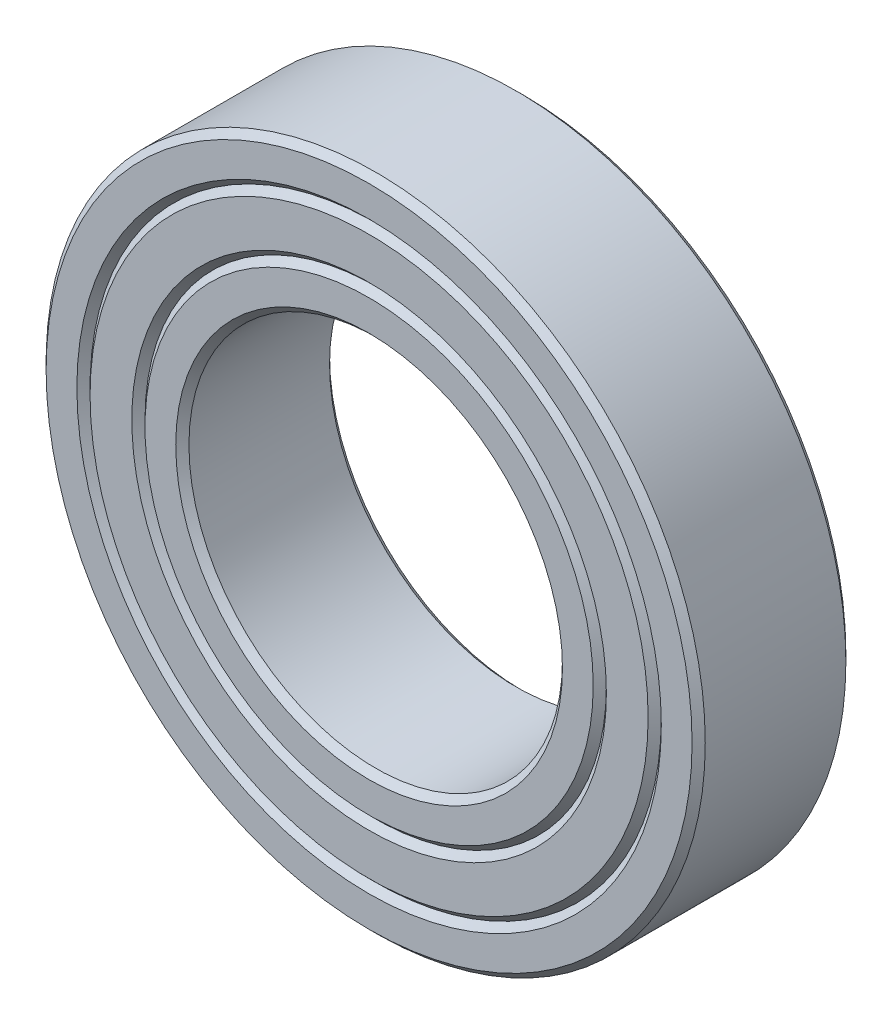
ISO-10303-21;
HEADER;
FILE_DESCRIPTION(('STEP AP214'),'2;1');
FILE_NAME('part.step','',(''),(''),'','','');
FILE_SCHEMA(('AUTOMOTIVE_DESIGN { 1 0 10303 214 1 1 1 1 }'));
ENDSEC;
DATA;
#1=APPLICATION_CONTEXT('core data for automotive mechanical design processes');
#2=APPLICATION_PROTOCOL_DEFINITION('international standard','automotive_design',2000,#1);
#3=PRODUCT_CONTEXT('',#1,'mechanical');
#4=PRODUCT('Part','Part','',(#3));
#5=PRODUCT_RELATED_PRODUCT_CATEGORY('part','',(#4));
#6=PRODUCT_DEFINITION_FORMATION('','',#4);
#7=PRODUCT_DEFINITION_CONTEXT('part definition',#1,'design');
#8=PRODUCT_DEFINITION('design','',#6,#7);
#9=PRODUCT_DEFINITION_SHAPE('','',#8);
#10=(LENGTH_UNIT() NAMED_UNIT(*) SI_UNIT(.MILLI.,.METRE.));
#11=(NAMED_UNIT(*) PLANE_ANGLE_UNIT() SI_UNIT($,.RADIAN.));
#12=(NAMED_UNIT(*) SI_UNIT($,.STERADIAN.) SOLID_ANGLE_UNIT());
#13=UNCERTAINTY_MEASURE_WITH_UNIT(LENGTH_MEASURE(1.E-05),#10,'distance_accuracy_value','');
#14=(GEOMETRIC_REPRESENTATION_CONTEXT(3) GLOBAL_UNCERTAINTY_ASSIGNED_CONTEXT((#13)) GLOBAL_UNIT_ASSIGNED_CONTEXT((#10,
#11,#12)) REPRESENTATION_CONTEXT('',''));
#15=CARTESIAN_POINT('',(0.,0.,0.));
#16=DIRECTION('',(0.,0.,1.));
#17=DIRECTION('',(1.,0.,0.));
#18=AXIS2_PLACEMENT_3D('',#15,#16,#17);
#19=CARTESIAN_POINT('',(0.,0.,-3.51));
#20=DIRECTION('',(0.,0.,1.));
#21=DIRECTION('',(1.,0.,0.));
#22=AXIS2_PLACEMENT_3D('',#19,#20,#21);
#23=CYLINDRICAL_SURFACE('',#22,10.5);
#24=CARTESIAN_POINT('',(0.,0.,-3.19999999999999));
#25=DIRECTION('',(0.,0.,1.));
#26=DIRECTION('',(1.,0.,0.));
#27=AXIS2_PLACEMENT_3D('',#24,#25,#26);
#28=CIRCLE('',#27,10.5);
#29=CARTESIAN_POINT('',(10.5,0.,-3.19999999999999));
#30=VERTEX_POINT('',#29);
#31=EDGE_CURVE('E75',#30,#30,#28,.T.);
#32=CARTESIAN_POINT('',(0.,0.,3.2));
#33=DIRECTION('',(0.,0.,1.));
#34=DIRECTION('',(1.,0.,0.));
#35=AXIS2_PLACEMENT_3D('',#32,#33,#34);
#36=CIRCLE('',#35,10.5);
#37=CARTESIAN_POINT('',(10.5,0.,3.2));
#38=VERTEX_POINT('',#37);
#39=EDGE_CURVE('E78',#38,#38,#36,.F.);
#40=CARTESIAN_POINT('',(10.5,0.,-3.19999999999999));
#41=CARTESIAN_POINT('',(10.5,0.,-3.13333333333332));
#42=CARTESIAN_POINT('',(10.5,0.,-3.06666666666665));
#43=CARTESIAN_POINT('',(10.5,0.,-2.93333333333332));
#44=CARTESIAN_POINT('',(10.5,0.,-2.86666666666666));
#45=CARTESIAN_POINT('',(10.5,0.,-2.73333333333332));
#46=CARTESIAN_POINT('',(10.5,0.,-2.66666666666666));
#47=CARTESIAN_POINT('',(10.5,0.,-2.53333333333332));
#48=CARTESIAN_POINT('',(10.5,0.,-2.46666666666666));
#49=CARTESIAN_POINT('',(10.5,0.,-2.33333333333332));
#50=CARTESIAN_POINT('',(10.5,0.,-2.26666666666666));
#51=CARTESIAN_POINT('',(10.5,0.,-2.13333333333332));
#52=CARTESIAN_POINT('',(10.5,0.,-2.06666666666666));
#53=CARTESIAN_POINT('',(10.5,0.,-1.93333333333332));
#54=CARTESIAN_POINT('',(10.5,0.,-1.86666666666666));
#55=CARTESIAN_POINT('',(10.5,0.,-1.73333333333332));
#56=CARTESIAN_POINT('',(10.5,0.,-1.66666666666666));
#57=CARTESIAN_POINT('',(10.5,0.,-1.53333333333332));
#58=CARTESIAN_POINT('',(10.5,0.,-1.46666666666666));
#59=CARTESIAN_POINT('',(10.5,0.,-1.33333333333332));
#60=CARTESIAN_POINT('',(10.5,0.,-1.26666666666666));
#61=CARTESIAN_POINT('',(10.5,0.,-1.13333333333332));
#62=CARTESIAN_POINT('',(10.5,0.,-1.06666666666666));
#63=CARTESIAN_POINT('',(10.5,0.,-0.933333333333325));
#64=CARTESIAN_POINT('',(10.5,0.,-0.866666666666658));
#65=CARTESIAN_POINT('',(10.5,0.,-0.733333333333325));
#66=CARTESIAN_POINT('',(10.5,0.,-0.666666666666659));
#67=CARTESIAN_POINT('',(10.5,0.,-0.533333333333326));
#68=CARTESIAN_POINT('',(10.5,0.,-0.466666666666659));
#69=CARTESIAN_POINT('',(10.5,0.,-0.333333333333326));
#70=CARTESIAN_POINT('',(10.5,0.,-0.266666666666659));
#71=CARTESIAN_POINT('',(10.5,0.,-0.133333333333326));
#72=CARTESIAN_POINT('',(10.5,0.,-0.0666666666666596));
#73=CARTESIAN_POINT('',(10.5,0.,0.0666666666666735));
#74=CARTESIAN_POINT('',(10.5,0.,0.13333333333334));
#75=CARTESIAN_POINT('',(10.5,0.,0.266666666666673));
#76=CARTESIAN_POINT('',(10.5,0.,0.333333333333339));
#77=CARTESIAN_POINT('',(10.5,0.,0.466666666666672));
#78=CARTESIAN_POINT('',(10.5,0.,0.533333333333339));
#79=CARTESIAN_POINT('',(10.5,0.,0.666666666666672));
#80=CARTESIAN_POINT('',(10.5,0.,0.733333333333338));
#81=CARTESIAN_POINT('',(10.5,0.,0.866666666666671));
#82=CARTESIAN_POINT('',(10.5,0.,0.933333333333338));
#83=CARTESIAN_POINT('',(10.5,0.,1.06666666666667));
#84=CARTESIAN_POINT('',(10.5,0.,1.13333333333334));
#85=CARTESIAN_POINT('',(10.5,0.,1.26666666666667));
#86=CARTESIAN_POINT('',(10.5,0.,1.33333333333334));
#87=CARTESIAN_POINT('',(10.5,0.,1.46666666666667));
#88=CARTESIAN_POINT('',(10.5,0.,1.53333333333334));
#89=CARTESIAN_POINT('',(10.5,0.,1.66666666666667));
#90=CARTESIAN_POINT('',(10.5,0.,1.73333333333334));
#91=CARTESIAN_POINT('',(10.5,0.,1.86666666666667));
#92=CARTESIAN_POINT('',(10.5,0.,1.93333333333334));
#93=CARTESIAN_POINT('',(10.5,0.,2.06666666666667));
#94=CARTESIAN_POINT('',(10.5,0.,2.13333333333334));
#95=CARTESIAN_POINT('',(10.5,0.,2.26666666666667));
#96=CARTESIAN_POINT('',(10.5,0.,2.33333333333334));
#97=CARTESIAN_POINT('',(10.5,0.,2.46666666666667));
#98=CARTESIAN_POINT('',(10.5,0.,2.53333333333334));
#99=CARTESIAN_POINT('',(10.5,0.,2.66666666666667));
#100=CARTESIAN_POINT('',(10.5,0.,2.73333333333334));
#101=CARTESIAN_POINT('',(10.5,0.,2.86666666666667));
#102=CARTESIAN_POINT('',(10.5,0.,2.93333333333333));
#103=CARTESIAN_POINT('',(10.5,0.,3.06666666666667));
#104=CARTESIAN_POINT('',(10.5,0.,3.13333333333333));
#105=CARTESIAN_POINT('',(10.5,0.,3.2));
#106=B_SPLINE_CURVE_WITH_KNOTS('',3,(#40,#41,#42,#43,#44,#45,#46,#47,#48,#49,#50,#51,#52,#53,
#54,#55,#56,#57,#58,#59,#60,#61,#62,#63,#64,#65,#66,#67,#68,#69,#70,#71,#72,#73,#74,#75,#76,#77,
#78,#79,#80,#81,#82,#83,#84,#85,#86,#87,#88,#89,#90,#91,#92,#93,#94,#95,#96,#97,#98,#99,#100,
#101,#102,#103,#104,#105),.UNSPECIFIED.,.F.,.F.,(4,2,2,2,2,2,2,2,2,2,2,2,2,2,2,2,2,2,2,2,2,2,2,
2,2,2,2,2,2,2,2,2,4),(0.,0.2,0.399999999999999,0.599999999999999,0.799999999999998,
0.999999999999998,1.2,1.4,1.6,1.8,2.,2.2,2.4,2.6,2.8,3.,3.19999999999999,3.39999999999999,
3.59999999999999,3.79999999999999,3.99999999999999,4.19999999999999,4.39999999999999,
4.59999999999999,4.79999999999999,4.99999999999999,5.19999999999999,5.39999999999999,
5.59999999999999,5.79999999999999,5.99999999999999,6.19999999999999,6.39999999999999),.UNSPECIFIED.);
#107=EDGE_CURVE('BSEAM48',#30,#38,#106,.T.);
#108=ORIENTED_EDGE('',*,*,#31,.T.);
#109=ORIENTED_EDGE('',*,*,#39,.T.);
#110=ORIENTED_EDGE('',*,*,#107,.T.);
#111=ORIENTED_EDGE('',*,*,#107,.F.);
#112=EDGE_LOOP('',(#108,#110,#109,#111));
#113=FACE_BOUND('',#112,.T.);
#114=ADVANCED_FACE('F48',(#113),#23,.T.);
#115=CARTESIAN_POINT('',(0.,0.,3.5));
#116=DIRECTION('',(0.,0.,-1.));
#117=DIRECTION('',(-1.,0.,0.));
#118=AXIS2_PLACEMENT_3D('',#115,#116,#117);
#119=CYLINDRICAL_SURFACE('',#118,8.5);
#120=CARTESIAN_POINT('',(0.,0.,-3.2));
#121=DIRECTION('',(0.,0.,1.));
#122=DIRECTION('',(1.,0.,0.));
#123=AXIS2_PLACEMENT_3D('',#120,#121,#122);
#124=CIRCLE('',#123,8.5);
#125=CARTESIAN_POINT('',(8.5,0.,-3.2));
#126=VERTEX_POINT('',#125);
#127=EDGE_CURVE('E60',#126,#126,#124,.F.);
#128=ORIENTED_EDGE('',*,*,#127,.T.);
#129=EDGE_LOOP('',(#128));
#130=FACE_BOUND('',#129,.T.);
#131=CARTESIAN_POINT('',(0.,0.,3.2));
#132=DIRECTION('',(0.,0.,1.));
#133=DIRECTION('',(1.,0.,0.));
#134=AXIS2_PLACEMENT_3D('',#131,#132,#133);
#135=CIRCLE('',#134,8.5);
#136=CARTESIAN_POINT('',(8.5,0.,3.2));
#137=VERTEX_POINT('',#136);
#138=EDGE_CURVE('E64',#137,#137,#135,.T.);
#139=ORIENTED_EDGE('',*,*,#138,.T.);
#140=EDGE_LOOP('',(#139));
#141=FACE_BOUND('',#140,.T.);
#142=ADVANCED_FACE('F96',(#130,#141),#119,.F.);
#143=CARTESIAN_POINT('',(0.,0.,-3.5));
#144=DIRECTION('',(0.,0.,1.));
#145=DIRECTION('',(1.,0.,0.));
#146=AXIS2_PLACEMENT_3D('',#143,#144,#145);
#147=PLANE('',#146);
#148=CARTESIAN_POINT('',(0.,0.,-3.5));
#149=DIRECTION('',(0.,0.,1.));
#150=DIRECTION('',(1.,0.,0.));
#151=AXIS2_PLACEMENT_3D('',#148,#149,#150);
#152=CIRCLE('',#151,10.2);
#153=CARTESIAN_POINT('',(10.2,0.,-3.5));
#154=VERTEX_POINT('',#153);
#155=EDGE_CURVE('E69',#154,#154,#152,.F.);
#156=ORIENTED_EDGE('',*,*,#155,.T.);
#157=EDGE_LOOP('',(#156));
#158=FACE_BOUND('',#157,.T.);
#159=CARTESIAN_POINT('',(0.,0.,-3.5));
#160=DIRECTION('',(0.,0.,1.));
#161=DIRECTION('',(1.,0.,0.));
#162=AXIS2_PLACEMENT_3D('',#159,#160,#161);
#163=CIRCLE('',#162,8.8);
#164=CARTESIAN_POINT('',(8.8,0.,-3.5));
#165=VERTEX_POINT('',#164);
#166=EDGE_CURVE('E72',#165,#165,#163,.T.);
#167=ORIENTED_EDGE('',*,*,#166,.T.);
#168=EDGE_LOOP('',(#167));
#169=FACE_BOUND('',#168,.T.);
#170=ADVANCED_FACE('F98',(#158,#169),#147,.F.);
#171=CARTESIAN_POINT('',(0.,0.,3.5));
#172=DIRECTION('',(0.,0.,1.));
#173=DIRECTION('',(1.,0.,0.));
#174=AXIS2_PLACEMENT_3D('',#171,#172,#173);
#175=PLANE('',#174);
#176=CARTESIAN_POINT('',(0.,0.,3.5));
#177=DIRECTION('',(0.,0.,1.));
#178=DIRECTION('',(1.,0.,0.));
#179=AXIS2_PLACEMENT_3D('',#176,#177,#178);
#180=CIRCLE('',#179,10.2);
#181=CARTESIAN_POINT('',(10.2,0.,3.5));
#182=VERTEX_POINT('',#181);
#183=EDGE_CURVE('E11',#182,#182,#180,.T.);
#184=ORIENTED_EDGE('',*,*,#183,.T.);
#185=EDGE_LOOP('',(#184));
#186=FACE_BOUND('',#185,.T.);
#187=CARTESIAN_POINT('',(0.,0.,3.5));
#188=DIRECTION('',(0.,0.,1.));
#189=DIRECTION('',(1.,0.,0.));
#190=AXIS2_PLACEMENT_3D('',#187,#188,#189);
#191=CIRCLE('',#190,8.8);
#192=CARTESIAN_POINT('',(8.8,0.,3.5));
#193=VERTEX_POINT('',#192);
#194=EDGE_CURVE('E56',#193,#193,#191,.F.);
#195=ORIENTED_EDGE('',*,*,#194,.T.);
#196=EDGE_LOOP('',(#195));
#197=FACE_BOUND('',#196,.T.);
#198=ADVANCED_FACE('F105',(#186,#197),#175,.T.);
#199=CARTESIAN_POINT('',(0.,0.,-3.19999999999999));
#200=DIRECTION('',(0.,0.,1.));
#201=DIRECTION('',(1.,0.,0.));
#202=AXIS2_PLACEMENT_3D('',#199,#200,#201);
#203=CONICAL_SURFACE('',#202,10.5,0.785398163397448);
#204=ORIENTED_EDGE('',*,*,#155,.F.);
#205=EDGE_LOOP('',(#204));
#206=FACE_BOUND('',#205,.T.);
#207=ORIENTED_EDGE('',*,*,#31,.F.);
#208=EDGE_LOOP('',(#207));
#209=FACE_BOUND('',#208,.T.);
#210=ADVANCED_FACE('F92',(#206,#209),#203,.T.);
#211=CARTESIAN_POINT('',(0.,0.,-3.5));
#212=DIRECTION('',(0.,0.,-1.));
#213=DIRECTION('',(-1.,0.,0.));
#214=AXIS2_PLACEMENT_3D('',#211,#212,#213);
#215=CONICAL_SURFACE('',#214,8.8,0.78539816339744);
#216=ORIENTED_EDGE('',*,*,#127,.F.);
#217=EDGE_LOOP('',(#216));
#218=FACE_BOUND('',#217,.T.);
#219=ORIENTED_EDGE('',*,*,#166,.F.);
#220=EDGE_LOOP('',(#219));
#221=FACE_BOUND('',#220,.T.);
#222=ADVANCED_FACE('F86',(#218,#221),#215,.F.);
#223=CARTESIAN_POINT('',(0.,0.,3.5));
#224=DIRECTION('',(0.,0.,-1.));
#225=DIRECTION('',(-1.,0.,0.));
#226=AXIS2_PLACEMENT_3D('',#223,#224,#225);
#227=CONICAL_SURFACE('',#226,10.2,0.785398163397437);
#228=ORIENTED_EDGE('',*,*,#39,.F.);
#229=EDGE_LOOP('',(#228));
#230=FACE_BOUND('',#229,.T.);
#231=ORIENTED_EDGE('',*,*,#183,.F.);
#232=EDGE_LOOP('',(#231));
#233=FACE_BOUND('',#232,.T.);
#234=ADVANCED_FACE('F83',(#230,#233),#227,.T.);
#235=CARTESIAN_POINT('',(0.,0.,3.2));
#236=DIRECTION('',(0.,0.,1.));
#237=DIRECTION('',(1.,0.,0.));
#238=AXIS2_PLACEMENT_3D('',#235,#236,#237);
#239=CONICAL_SURFACE('',#238,8.5,0.785398163397445);
#240=ORIENTED_EDGE('',*,*,#194,.F.);
#241=EDGE_LOOP('',(#240));
#242=FACE_BOUND('',#241,.T.);
#243=ORIENTED_EDGE('',*,*,#138,.F.);
#244=EDGE_LOOP('',(#243));
#245=FACE_BOUND('',#244,.T.);
#246=ADVANCED_FACE('F51',(#242,#245),#239,.F.);
#247=CLOSED_SHELL('',(#114,#142,#170,#198,#210,#222,#234,#246));
#248=MANIFOLD_SOLID_BREP('B2',#247);
#249=CARTESIAN_POINT('',(0.,0.,-3.51));
#250=DIRECTION('',(0.,0.,1.));
#251=DIRECTION('',(1.,0.,0.));
#252=AXIS2_PLACEMENT_3D('',#249,#250,#251);
#253=CYLINDRICAL_SURFACE('',#252,10.5);
#254=CARTESIAN_POINT('',(0.,0.,3.19999999999998));
#255=DIRECTION('',(0.,0.,1.));
#256=DIRECTION('',(1.,0.,0.));
#257=AXIS2_PLACEMENT_3D('',#254,#255,#256);
#258=CIRCLE('',#257,10.5);
#259=CARTESIAN_POINT('',(10.5,0.,3.19999999999998));
#260=VERTEX_POINT('',#259);
#261=EDGE_CURVE('E201',#260,#260,#258,.T.);
#262=CARTESIAN_POINT('',(0.,0.,-3.20000000000001));
#263=DIRECTION('',(0.,0.,1.));
#264=DIRECTION('',(1.,0.,0.));
#265=AXIS2_PLACEMENT_3D('',#262,#263,#264);
#266=CIRCLE('',#265,10.5);
#267=CARTESIAN_POINT('',(10.5,0.,-3.20000000000001));
#268=VERTEX_POINT('',#267);
#269=EDGE_CURVE('E205',#268,#268,#266,.F.);
#270=CARTESIAN_POINT('',(10.5,0.,3.19999999999998));
#271=CARTESIAN_POINT('',(10.5,0.,3.13333333333331));
#272=CARTESIAN_POINT('',(10.5,0.,3.06666666666664));
#273=CARTESIAN_POINT('',(10.5,0.,2.93333333333331));
#274=CARTESIAN_POINT('',(10.5,0.,2.86666666666664));
#275=CARTESIAN_POINT('',(10.5,0.,2.73333333333331));
#276=CARTESIAN_POINT('',(10.5,0.,2.66666666666664));
#277=CARTESIAN_POINT('',(10.5,0.,2.53333333333331));
#278=CARTESIAN_POINT('',(10.5,0.,2.46666666666665));
#279=CARTESIAN_POINT('',(10.5,0.,2.33333333333331));
#280=CARTESIAN_POINT('',(10.5,0.,2.26666666666665));
#281=CARTESIAN_POINT('',(10.5,0.,2.13333333333331));
#282=CARTESIAN_POINT('',(10.5,0.,2.06666666666665));
#283=CARTESIAN_POINT('',(10.5,0.,1.93333333333331));
#284=CARTESIAN_POINT('',(10.5,0.,1.86666666666665));
#285=CARTESIAN_POINT('',(10.5,0.,1.73333333333331));
#286=CARTESIAN_POINT('',(10.5,0.,1.66666666666665));
#287=CARTESIAN_POINT('',(10.5,0.,1.53333333333331));
#288=CARTESIAN_POINT('',(10.5,0.,1.46666666666665));
#289=CARTESIAN_POINT('',(10.5,0.,1.33333333333331));
#290=CARTESIAN_POINT('',(10.5,0.,1.26666666666665));
#291=CARTESIAN_POINT('',(10.5,0.,1.13333333333331));
#292=CARTESIAN_POINT('',(10.5,0.,1.06666666666665));
#293=CARTESIAN_POINT('',(10.5,0.,0.933333333333313));
#294=CARTESIAN_POINT('',(10.5,0.,0.866666666666647));
#295=CARTESIAN_POINT('',(10.5,0.,0.733333333333314));
#296=CARTESIAN_POINT('',(10.5,0.,0.666666666666647));
#297=CARTESIAN_POINT('',(10.5,0.,0.533333333333314));
#298=CARTESIAN_POINT('',(10.5,0.,0.466666666666648));
#299=CARTESIAN_POINT('',(10.5,0.,0.333333333333315));
#300=CARTESIAN_POINT('',(10.5,0.,0.266666666666648));
#301=CARTESIAN_POINT('',(10.5,0.,0.133333333333315));
#302=CARTESIAN_POINT('',(10.5,0.,0.0666666666666487));
#303=CARTESIAN_POINT('',(10.5,0.,-0.0666666666666843));
#304=CARTESIAN_POINT('',(10.5,0.,-0.133333333333351));
#305=CARTESIAN_POINT('',(10.5,0.,-0.266666666666684));
#306=CARTESIAN_POINT('',(10.5,0.,-0.333333333333351));
#307=CARTESIAN_POINT('',(10.5,0.,-0.466666666666684));
#308=CARTESIAN_POINT('',(10.5,0.,-0.53333333333335));
#309=CARTESIAN_POINT('',(10.5,0.,-0.666666666666683));
#310=CARTESIAN_POINT('',(10.5,0.,-0.73333333333335));
#311=CARTESIAN_POINT('',(10.5,0.,-0.866666666666683));
#312=CARTESIAN_POINT('',(10.5,0.,-0.93333333333335));
#313=CARTESIAN_POINT('',(10.5,0.,-1.06666666666668));
#314=CARTESIAN_POINT('',(10.5,0.,-1.13333333333335));
#315=CARTESIAN_POINT('',(10.5,0.,-1.26666666666668));
#316=CARTESIAN_POINT('',(10.5,0.,-1.33333333333335));
#317=CARTESIAN_POINT('',(10.5,0.,-1.46666666666668));
#318=CARTESIAN_POINT('',(10.5,0.,-1.53333333333335));
#319=CARTESIAN_POINT('',(10.5,0.,-1.66666666666668));
#320=CARTESIAN_POINT('',(10.5,0.,-1.73333333333335));
#321=CARTESIAN_POINT('',(10.5,0.,-1.86666666666668));
#322=CARTESIAN_POINT('',(10.5,0.,-1.93333333333335));
#323=CARTESIAN_POINT('',(10.5,0.,-2.06666666666668));
#324=CARTESIAN_POINT('',(10.5,0.,-2.13333333333335));
#325=CARTESIAN_POINT('',(10.5,0.,-2.26666666666668));
#326=CARTESIAN_POINT('',(10.5,0.,-2.33333333333335));
#327=CARTESIAN_POINT('',(10.5,0.,-2.46666666666668));
#328=CARTESIAN_POINT('',(10.5,0.,-2.53333333333335));
#329=CARTESIAN_POINT('',(10.5,0.,-2.66666666666668));
#330=CARTESIAN_POINT('',(10.5,0.,-2.73333333333335));
#331=CARTESIAN_POINT('',(10.5,0.,-2.86666666666668));
#332=CARTESIAN_POINT('',(10.5,0.,-2.93333333333335));
#333=CARTESIAN_POINT('',(10.5,0.,-3.06666666666668));
#334=CARTESIAN_POINT('',(10.5,0.,-3.13333333333335));
#335=CARTESIAN_POINT('',(10.5,0.,-3.20000000000001));
#336=B_SPLINE_CURVE_WITH_KNOTS('',3,(#270,#271,#272,#273,#274,#275,#276,#277,#278,#279,#280,
#281,#282,#283,#284,#285,#286,#287,#288,#289,#290,#291,#292,#293,#294,#295,#296,#297,#298,#299,
#300,#301,#302,#303,#304,#305,#306,#307,#308,#309,#310,#311,#312,#313,#314,#315,#316,#317,#318,
#319,#320,#321,#322,#323,#324,#325,#326,#327,#328,#329,#330,#331,#332,#333,#334,#335),
.UNSPECIFIED.,.F.,.F.,(4,2,2,2,2,2,2,2,2,2,2,2,2,2,2,2,2,2,2,2,2,2,2,2,2,2,2,2,2,2,2,2,4),(0.,
0.2,0.399999999999999,0.599999999999999,0.799999999999999,0.999999999999998,1.2,1.4,1.6,1.8,2.,
2.2,2.4,2.6,2.8,3.,3.19999999999999,3.39999999999999,3.59999999999999,3.79999999999999,
3.99999999999999,4.19999999999999,4.39999999999999,4.59999999999999,4.79999999999999,
4.99999999999999,5.19999999999999,5.39999999999999,5.59999999999999,5.79999999999999,
5.99999999999999,6.19999999999999,6.39999999999999),.UNSPECIFIED.);
#337=EDGE_CURVE('BSEAM189',#260,#268,#336,.T.);
#338=ORIENTED_EDGE('',*,*,#261,.T.);
#339=ORIENTED_EDGE('',*,*,#269,.T.);
#340=ORIENTED_EDGE('',*,*,#337,.T.);
#341=ORIENTED_EDGE('',*,*,#337,.F.);
#342=EDGE_LOOP('',(#338,#340,#339,#341));
#343=FACE_BOUND('',#342,.T.);
#344=ADVANCED_FACE('F189',(#343),#253,.F.);
#345=CARTESIAN_POINT('',(0.,0.,-3.51));
#346=DIRECTION('',(0.,0.,1.));
#347=DIRECTION('',(1.,0.,0.));
#348=AXIS2_PLACEMENT_3D('',#345,#346,#347);
#349=CYLINDRICAL_SURFACE('',#348,13.);
#350=CARTESIAN_POINT('',(0.,0.,3.20000000000002));
#351=DIRECTION('',(0.,0.,1.));
#352=DIRECTION('',(1.,0.,0.));
#353=AXIS2_PLACEMENT_3D('',#350,#351,#352);
#354=CIRCLE('',#353,13.);
#355=CARTESIAN_POINT('',(13.,0.,3.20000000000002));
#356=VERTEX_POINT('',#355);
#357=EDGE_CURVE('E210',#356,#356,#354,.F.);
#358=CARTESIAN_POINT('',(0.,0.,-3.19999999999999));
#359=DIRECTION('',(0.,0.,1.));
#360=DIRECTION('',(1.,0.,0.));
#361=AXIS2_PLACEMENT_3D('',#358,#359,#360);
#362=CIRCLE('',#361,13.);
#363=CARTESIAN_POINT('',(13.,0.,-3.19999999999999));
#364=VERTEX_POINT('',#363);
#365=EDGE_CURVE('E213',#364,#364,#362,.T.);
#366=CARTESIAN_POINT('',(13.,0.,3.20000000000002));
#367=CARTESIAN_POINT('',(13.,0.,3.13333333333335));
#368=CARTESIAN_POINT('',(13.,0.,3.06666666666668));
#369=CARTESIAN_POINT('',(13.,0.,2.93333333333335));
#370=CARTESIAN_POINT('',(13.,0.,2.86666666666668));
#371=CARTESIAN_POINT('',(13.,0.,2.73333333333335));
#372=CARTESIAN_POINT('',(13.,0.,2.66666666666668));
#373=CARTESIAN_POINT('',(13.,0.,2.53333333333335));
#374=CARTESIAN_POINT('',(13.,0.,2.46666666666668));
#375=CARTESIAN_POINT('',(13.,0.,2.33333333333335));
#376=CARTESIAN_POINT('',(13.,0.,2.26666666666668));
#377=CARTESIAN_POINT('',(13.,0.,2.13333333333335));
#378=CARTESIAN_POINT('',(13.,0.,2.06666666666668));
#379=CARTESIAN_POINT('',(13.,0.,1.93333333333335));
#380=CARTESIAN_POINT('',(13.,0.,1.86666666666668));
#381=CARTESIAN_POINT('',(13.,0.,1.73333333333335));
#382=CARTESIAN_POINT('',(13.,0.,1.66666666666668));
#383=CARTESIAN_POINT('',(13.,0.,1.53333333333335));
#384=CARTESIAN_POINT('',(13.,0.,1.46666666666668));
#385=CARTESIAN_POINT('',(13.,0.,1.33333333333335));
#386=CARTESIAN_POINT('',(13.,0.,1.26666666666668));
#387=CARTESIAN_POINT('',(13.,0.,1.13333333333335));
#388=CARTESIAN_POINT('',(13.,0.,1.06666666666668));
#389=CARTESIAN_POINT('',(13.,0.,0.933333333333346));
#390=CARTESIAN_POINT('',(13.,0.,0.866666666666679));
#391=CARTESIAN_POINT('',(13.,0.,0.733333333333346));
#392=CARTESIAN_POINT('',(13.,0.,0.666666666666679));
#393=CARTESIAN_POINT('',(13.,0.,0.533333333333346));
#394=CARTESIAN_POINT('',(13.,0.,0.466666666666679));
#395=CARTESIAN_POINT('',(13.,0.,0.333333333333346));
#396=CARTESIAN_POINT('',(13.,0.,0.266666666666679));
#397=CARTESIAN_POINT('',(13.,0.,0.133333333333346));
#398=CARTESIAN_POINT('',(13.,0.,0.0666666666666793));
#399=CARTESIAN_POINT('',(13.,0.,-0.0666666666666541));
#400=CARTESIAN_POINT('',(13.,0.,-0.133333333333321));
#401=CARTESIAN_POINT('',(13.,0.,-0.266666666666654));
#402=CARTESIAN_POINT('',(13.,0.,-0.333333333333321));
#403=CARTESIAN_POINT('',(13.,0.,-0.466666666666654));
#404=CARTESIAN_POINT('',(13.,0.,-0.533333333333321));
#405=CARTESIAN_POINT('',(13.,0.,-0.666666666666655));
#406=CARTESIAN_POINT('',(13.,0.,-0.733333333333321));
#407=CARTESIAN_POINT('',(13.,0.,-0.866666666666655));
#408=CARTESIAN_POINT('',(13.,0.,-0.933333333333321));
#409=CARTESIAN_POINT('',(13.,0.,-1.06666666666666));
#410=CARTESIAN_POINT('',(13.,0.,-1.13333333333332));
#411=CARTESIAN_POINT('',(13.,0.,-1.26666666666666));
#412=CARTESIAN_POINT('',(13.,0.,-1.33333333333332));
#413=CARTESIAN_POINT('',(13.,0.,-1.46666666666666));
#414=CARTESIAN_POINT('',(13.,0.,-1.53333333333332));
#415=CARTESIAN_POINT('',(13.,0.,-1.66666666666666));
#416=CARTESIAN_POINT('',(13.,0.,-1.73333333333332));
#417=CARTESIAN_POINT('',(13.,0.,-1.86666666666666));
#418=CARTESIAN_POINT('',(13.,0.,-1.93333333333332));
#419=CARTESIAN_POINT('',(13.,0.,-2.06666666666666));
#420=CARTESIAN_POINT('',(13.,0.,-2.13333333333332));
#421=CARTESIAN_POINT('',(13.,0.,-2.26666666666666));
#422=CARTESIAN_POINT('',(13.,0.,-2.33333333333332));
#423=CARTESIAN_POINT('',(13.,0.,-2.46666666666666));
#424=CARTESIAN_POINT('',(13.,0.,-2.53333333333332));
#425=CARTESIAN_POINT('',(13.,0.,-2.66666666666666));
#426=CARTESIAN_POINT('',(13.,0.,-2.73333333333332));
#427=CARTESIAN_POINT('',(13.,0.,-2.86666666666666));
#428=CARTESIAN_POINT('',(13.,0.,-2.93333333333332));
#429=CARTESIAN_POINT('',(13.,0.,-3.06666666666666));
#430=CARTESIAN_POINT('',(13.,0.,-3.13333333333332));
#431=CARTESIAN_POINT('',(13.,0.,-3.19999999999999));
#432=B_SPLINE_CURVE_WITH_KNOTS('',3,(#366,#367,#368,#369,#370,#371,#372,#373,#374,#375,#376,
#377,#378,#379,#380,#381,#382,#383,#384,#385,#386,#387,#388,#389,#390,#391,#392,#393,#394,#395,
#396,#397,#398,#399,#400,#401,#402,#403,#404,#405,#406,#407,#408,#409,#410,#411,#412,#413,#414,
#415,#416,#417,#418,#419,#420,#421,#422,#423,#424,#425,#426,#427,#428,#429,#430,#431),
.UNSPECIFIED.,.F.,.F.,(4,2,2,2,2,2,2,2,2,2,2,2,2,2,2,2,2,2,2,2,2,2,2,2,2,2,2,2,2,2,2,2,4),(0.,
0.200000000000001,0.4,0.600000000000001,0.8,1.,1.2,1.4,1.6,1.8,2.,2.2,2.4,2.6,2.8,3.,3.2,3.4,
3.6,3.8,4.,4.2,4.4,4.6,4.80000000000001,5.00000000000001,5.2,5.40000000000001,5.60000000000001,
5.80000000000001,6.00000000000001,6.20000000000001,6.40000000000001),.UNSPECIFIED.);
#433=EDGE_CURVE('BSEAM235',#356,#364,#432,.T.);
#434=ORIENTED_EDGE('',*,*,#357,.T.);
#435=ORIENTED_EDGE('',*,*,#365,.T.);
#436=ORIENTED_EDGE('',*,*,#433,.T.);
#437=ORIENTED_EDGE('',*,*,#433,.F.);
#438=EDGE_LOOP('',(#434,#436,#435,#437));
#439=FACE_BOUND('',#438,.T.);
#440=ADVANCED_FACE('F235',(#439),#349,.T.);
#441=CARTESIAN_POINT('',(0.,0.,-3.5));
#442=DIRECTION('',(0.,0.,1.));
#443=DIRECTION('',(1.,0.,0.));
#444=AXIS2_PLACEMENT_3D('',#441,#442,#443);
#445=PLANE('',#444);
#446=CARTESIAN_POINT('',(0.,0.,-3.5));
#447=DIRECTION('',(0.,0.,1.));
#448=DIRECTION('',(1.,0.,0.));
#449=AXIS2_PLACEMENT_3D('',#446,#447,#448);
#450=CIRCLE('',#449,12.7);
#451=CARTESIAN_POINT('',(12.7,0.,-3.5));
#452=VERTEX_POINT('',#451);
#453=EDGE_CURVE('E47',#452,#452,#450,.F.);
#454=ORIENTED_EDGE('',*,*,#453,.T.);
#455=EDGE_LOOP('',(#454));
#456=FACE_BOUND('',#455,.T.);
#457=CARTESIAN_POINT('',(0.,0.,-3.5));
#458=DIRECTION('',(0.,0.,1.));
#459=DIRECTION('',(1.,0.,0.));
#460=AXIS2_PLACEMENT_3D('',#457,#458,#459);
#461=CIRCLE('',#460,10.8);
#462=CARTESIAN_POINT('',(10.8,0.,-3.5));
#463=VERTEX_POINT('',#462);
#464=EDGE_CURVE('E197',#463,#463,#461,.T.);
#465=ORIENTED_EDGE('',*,*,#464,.T.);
#466=EDGE_LOOP('',(#465));
#467=FACE_BOUND('',#466,.T.);
#468=ADVANCED_FACE('F261',(#456,#467),#445,.F.);
#469=CARTESIAN_POINT('',(0.,0.,3.5));
#470=DIRECTION('',(0.,0.,1.));
#471=DIRECTION('',(1.,0.,0.));
#472=AXIS2_PLACEMENT_3D('',#469,#470,#471);
#473=PLANE('',#472);
#474=CARTESIAN_POINT('',(0.,0.,3.5));
#475=DIRECTION('',(0.,0.,1.));
#476=DIRECTION('',(1.,0.,0.));
#477=AXIS2_PLACEMENT_3D('',#474,#475,#476);
#478=CIRCLE('',#477,12.7);
#479=CARTESIAN_POINT('',(12.7,0.,3.5));
#480=VERTEX_POINT('',#479);
#481=EDGE_CURVE('E216',#480,#480,#478,.T.);
#482=ORIENTED_EDGE('',*,*,#481,.T.);
#483=EDGE_LOOP('',(#482));
#484=FACE_BOUND('',#483,.T.);
#485=CARTESIAN_POINT('',(0.,0.,3.5));
#486=DIRECTION('',(0.,0.,1.));
#487=DIRECTION('',(1.,0.,0.));
#488=AXIS2_PLACEMENT_3D('',#485,#486,#487);
#489=CIRCLE('',#488,10.8);
#490=CARTESIAN_POINT('',(10.8,0.,3.5));
#491=VERTEX_POINT('',#490);
#492=EDGE_CURVE('E219',#491,#491,#489,.F.);
#493=ORIENTED_EDGE('',*,*,#492,.T.);
#494=EDGE_LOOP('',(#493));
#495=FACE_BOUND('',#494,.T.);
#496=ADVANCED_FACE('F223',(#484,#495),#473,.T.);
#497=CARTESIAN_POINT('',(0.,0.,3.5));
#498=DIRECTION('',(0.,0.,-1.));
#499=DIRECTION('',(-1.,0.,0.));
#500=AXIS2_PLACEMENT_3D('',#497,#498,#499);
#501=CONICAL_SURFACE('',#500,12.7,0.785398163397451);
#502=ORIENTED_EDGE('',*,*,#357,.F.);
#503=EDGE_LOOP('',(#502));
#504=FACE_BOUND('',#503,.T.);
#505=ORIENTED_EDGE('',*,*,#481,.F.);
#506=EDGE_LOOP('',(#505));
#507=FACE_BOUND('',#506,.T.);
#508=ADVANCED_FACE('F229',(#504,#507),#501,.T.);
#509=CARTESIAN_POINT('',(0.,0.,3.19999999999998));
#510=DIRECTION('',(0.,0.,1.));
#511=DIRECTION('',(1.,0.,0.));
#512=AXIS2_PLACEMENT_3D('',#509,#510,#511);
#513=CONICAL_SURFACE('',#512,10.5,0.785398163397443);
#514=ORIENTED_EDGE('',*,*,#492,.F.);
#515=EDGE_LOOP('',(#514));
#516=FACE_BOUND('',#515,.T.);
#517=ORIENTED_EDGE('',*,*,#261,.F.);
#518=EDGE_LOOP('',(#517));
#519=FACE_BOUND('',#518,.T.);
#520=ADVANCED_FACE('F225',(#516,#519),#513,.F.);
#521=CARTESIAN_POINT('',(0.,0.,-3.19999999999999));
#522=DIRECTION('',(0.,0.,1.));
#523=DIRECTION('',(1.,0.,0.));
#524=AXIS2_PLACEMENT_3D('',#521,#522,#523);
#525=CONICAL_SURFACE('',#524,13.,0.785398163397448);
#526=ORIENTED_EDGE('',*,*,#453,.F.);
#527=EDGE_LOOP('',(#526));
#528=FACE_BOUND('',#527,.T.);
#529=ORIENTED_EDGE('',*,*,#365,.F.);
#530=EDGE_LOOP('',(#529));
#531=FACE_BOUND('',#530,.T.);
#532=ADVANCED_FACE('F228',(#528,#531),#525,.T.);
#533=CARTESIAN_POINT('',(0.,0.,-3.5));
#534=DIRECTION('',(0.,0.,-1.));
#535=DIRECTION('',(-1.,0.,0.));
#536=AXIS2_PLACEMENT_3D('',#533,#534,#535);
#537=CONICAL_SURFACE('',#536,10.8,0.785398163397448);
#538=ORIENTED_EDGE('',*,*,#269,.F.);
#539=EDGE_LOOP('',(#538));
#540=FACE_BOUND('',#539,.T.);
#541=ORIENTED_EDGE('',*,*,#464,.F.);
#542=EDGE_LOOP('',(#541));
#543=FACE_BOUND('',#542,.T.);
#544=ADVANCED_FACE('F192',(#540,#543),#537,.F.);
#545=CLOSED_SHELL('',(#344,#440,#468,#496,#508,#520,#532,#544));
#546=MANIFOLD_SOLID_BREP('B6',#545);
#547=CARTESIAN_POINT('',(0.,0.,-3.51));
#548=DIRECTION('',(0.,0.,1.));
#549=DIRECTION('',(1.,0.,0.));
#550=AXIS2_PLACEMENT_3D('',#547,#548,#549);
#551=CYLINDRICAL_SURFACE('',#550,13.);
#552=CARTESIAN_POINT('',(0.,0.,-3.20000000000002));
#553=DIRECTION('',(0.,0.,1.));
#554=DIRECTION('',(1.,0.,0.));
#555=AXIS2_PLACEMENT_3D('',#552,#553,#554);
#556=CIRCLE('',#555,13.);
#557=CARTESIAN_POINT('',(13.,0.,-3.20000000000002));
#558=VERTEX_POINT('',#557);
#559=EDGE_CURVE('E335',#558,#558,#556,.F.);
#560=CARTESIAN_POINT('',(0.,0.,3.19999999999997));
#561=DIRECTION('',(0.,0.,1.));
#562=DIRECTION('',(1.,0.,0.));
#563=AXIS2_PLACEMENT_3D('',#560,#561,#562);
#564=CIRCLE('',#563,13.);
#565=CARTESIAN_POINT('',(13.,0.,3.19999999999997));
#566=VERTEX_POINT('',#565);
#567=EDGE_CURVE('E339',#566,#566,#564,.T.);
#568=CARTESIAN_POINT('',(13.,0.,-3.20000000000002));
#569=CARTESIAN_POINT('',(13.,0.,-3.13333333333335));
#570=CARTESIAN_POINT('',(13.,0.,-3.06666666666668));
#571=CARTESIAN_POINT('',(13.,0.,-2.93333333333335));
#572=CARTESIAN_POINT('',(13.,0.,-2.86666666666668));
#573=CARTESIAN_POINT('',(13.,0.,-2.73333333333335));
#574=CARTESIAN_POINT('',(13.,0.,-2.66666666666668));
#575=CARTESIAN_POINT('',(13.,0.,-2.53333333333335));
#576=CARTESIAN_POINT('',(13.,0.,-2.46666666666668));
#577=CARTESIAN_POINT('',(13.,0.,-2.33333333333335));
#578=CARTESIAN_POINT('',(13.,0.,-2.26666666666668));
#579=CARTESIAN_POINT('',(13.,0.,-2.13333333333335));
#580=CARTESIAN_POINT('',(13.,0.,-2.06666666666669));
#581=CARTESIAN_POINT('',(13.,0.,-1.93333333333335));
#582=CARTESIAN_POINT('',(13.,0.,-1.86666666666669));
#583=CARTESIAN_POINT('',(13.,0.,-1.73333333333335));
#584=CARTESIAN_POINT('',(13.,0.,-1.66666666666669));
#585=CARTESIAN_POINT('',(13.,0.,-1.53333333333335));
#586=CARTESIAN_POINT('',(13.,0.,-1.46666666666669));
#587=CARTESIAN_POINT('',(13.,0.,-1.33333333333335));
#588=CARTESIAN_POINT('',(13.,0.,-1.26666666666669));
#589=CARTESIAN_POINT('',(13.,0.,-1.13333333333335));
#590=CARTESIAN_POINT('',(13.,0.,-1.06666666666669));
#591=CARTESIAN_POINT('',(13.,0.,-0.933333333333353));
#592=CARTESIAN_POINT('',(13.,0.,-0.866666666666687));
#593=CARTESIAN_POINT('',(13.,0.,-0.733333333333354));
#594=CARTESIAN_POINT('',(13.,0.,-0.666666666666687));
#595=CARTESIAN_POINT('',(13.,0.,-0.533333333333354));
#596=CARTESIAN_POINT('',(13.,0.,-0.466666666666688));
#597=CARTESIAN_POINT('',(13.,0.,-0.333333333333354));
#598=CARTESIAN_POINT('',(13.,0.,-0.266666666666688));
#599=CARTESIAN_POINT('',(13.,0.,-0.133333333333355));
#600=CARTESIAN_POINT('',(13.,0.,-0.0666666666666882));
#601=CARTESIAN_POINT('',(13.,0.,0.0666666666666448));
#602=CARTESIAN_POINT('',(13.,0.,0.133333333333311));
#603=CARTESIAN_POINT('',(13.,0.,0.266666666666644));
#604=CARTESIAN_POINT('',(13.,0.,0.33333333333331));
#605=CARTESIAN_POINT('',(13.,0.,0.466666666666643));
#606=CARTESIAN_POINT('',(13.,0.,0.53333333333331));
#607=CARTESIAN_POINT('',(13.,0.,0.666666666666643));
#608=CARTESIAN_POINT('',(13.,0.,0.73333333333331));
#609=CARTESIAN_POINT('',(13.,0.,0.866666666666643));
#610=CARTESIAN_POINT('',(13.,0.,0.933333333333309));
#611=CARTESIAN_POINT('',(13.,0.,1.06666666666664));
#612=CARTESIAN_POINT('',(13.,0.,1.13333333333331));
#613=CARTESIAN_POINT('',(13.,0.,1.26666666666664));
#614=CARTESIAN_POINT('',(13.,0.,1.33333333333331));
#615=CARTESIAN_POINT('',(13.,0.,1.46666666666664));
#616=CARTESIAN_POINT('',(13.,0.,1.53333333333331));
#617=CARTESIAN_POINT('',(13.,0.,1.66666666666664));
#618=CARTESIAN_POINT('',(13.,0.,1.73333333333331));
#619=CARTESIAN_POINT('',(13.,0.,1.86666666666664));
#620=CARTESIAN_POINT('',(13.,0.,1.93333333333331));
#621=CARTESIAN_POINT('',(13.,0.,2.06666666666664));
#622=CARTESIAN_POINT('',(13.,0.,2.13333333333331));
#623=CARTESIAN_POINT('',(13.,0.,2.26666666666664));
#624=CARTESIAN_POINT('',(13.,0.,2.33333333333331));
#625=CARTESIAN_POINT('',(13.,0.,2.46666666666664));
#626=CARTESIAN_POINT('',(13.,0.,2.53333333333331));
#627=CARTESIAN_POINT('',(13.,0.,2.66666666666664));
#628=CARTESIAN_POINT('',(13.,0.,2.73333333333331));
#629=CARTESIAN_POINT('',(13.,0.,2.86666666666664));
#630=CARTESIAN_POINT('',(13.,0.,2.93333333333331));
#631=CARTESIAN_POINT('',(13.,0.,3.06666666666664));
#632=CARTESIAN_POINT('',(13.,0.,3.13333333333331));
#633=CARTESIAN_POINT('',(13.,0.,3.19999999999997));
#634=B_SPLINE_CURVE_WITH_KNOTS('',3,(#568,#569,#570,#571,#572,#573,#574,#575,#576,#577,#578,
#579,#580,#581,#582,#583,#584,#585,#586,#587,#588,#589,#590,#591,#592,#593,#594,#595,#596,#597,
#598,#599,#600,#601,#602,#603,#604,#605,#606,#607,#608,#609,#610,#611,#612,#613,#614,#615,#616,
#617,#618,#619,#620,#621,#622,#623,#624,#625,#626,#627,#628,#629,#630,#631,#632,#633),
.UNSPECIFIED.,.F.,.F.,(4,2,2,2,2,2,2,2,2,2,2,2,2,2,2,2,2,2,2,2,2,2,2,2,2,2,2,2,2,2,2,2,4),(0.,
0.199999999999999,0.399999999999999,0.599999999999999,0.799999999999998,0.999999999999998,1.2,
1.4,1.6,1.8,2.,2.2,2.4,2.6,2.79999999999999,2.99999999999999,3.19999999999999,3.39999999999999,
3.59999999999999,3.79999999999999,3.99999999999999,4.19999999999999,4.39999999999999,
4.59999999999999,4.79999999999999,4.99999999999999,5.19999999999999,5.39999999999999,
5.59999999999999,5.79999999999999,5.99999999999999,6.19999999999999,6.39999999999999),.UNSPECIFIED.);
#635=EDGE_CURVE('BSEAM323',#558,#566,#634,.T.);
#636=ORIENTED_EDGE('',*,*,#559,.T.);
#637=ORIENTED_EDGE('',*,*,#567,.T.);
#638=ORIENTED_EDGE('',*,*,#635,.T.);
#639=ORIENTED_EDGE('',*,*,#635,.F.);
#640=EDGE_LOOP('',(#636,#638,#637,#639));
#641=FACE_BOUND('',#640,.T.);
#642=ADVANCED_FACE('F323',(#641),#551,.F.);
#643=CARTESIAN_POINT('',(0.,0.,3.5));
#644=DIRECTION('',(0.,0.,-1.));
#645=DIRECTION('',(-1.,0.,0.));
#646=AXIS2_PLACEMENT_3D('',#643,#644,#645);
#647=CYLINDRICAL_SURFACE('',#646,15.);
#648=CARTESIAN_POINT('',(0.,0.,-3.20000000000001));
#649=DIRECTION('',(0.,0.,1.));
#650=DIRECTION('',(1.,0.,0.));
#651=AXIS2_PLACEMENT_3D('',#648,#649,#650);
#652=CIRCLE('',#651,15.);
#653=CARTESIAN_POINT('',(15.,0.,-3.20000000000001));
#654=VERTEX_POINT('',#653);
#655=EDGE_CURVE('E350',#654,#654,#652,.T.);
#656=ORIENTED_EDGE('',*,*,#655,.T.);
#657=EDGE_LOOP('',(#656));
#658=FACE_BOUND('',#657,.T.);
#659=CARTESIAN_POINT('',(0.,0.,3.20000000000001));
#660=DIRECTION('',(0.,0.,1.));
#661=DIRECTION('',(1.,0.,0.));
#662=AXIS2_PLACEMENT_3D('',#659,#660,#661);
#663=CIRCLE('',#662,15.);
#664=CARTESIAN_POINT('',(15.,0.,3.20000000000001));
#665=VERTEX_POINT('',#664);
#666=EDGE_CURVE('E353',#665,#665,#663,.F.);
#667=ORIENTED_EDGE('',*,*,#666,.T.);
#668=EDGE_LOOP('',(#667));
#669=FACE_BOUND('',#668,.T.);
#670=ADVANCED_FACE('F357',(#658,#669),#647,.T.);
#671=CARTESIAN_POINT('',(0.,0.,-3.5));
#672=DIRECTION('',(0.,0.,1.));
#673=DIRECTION('',(1.,0.,0.));
#674=AXIS2_PLACEMENT_3D('',#671,#672,#673);
#675=PLANE('',#674);
#676=CARTESIAN_POINT('',(0.,0.,-3.5));
#677=DIRECTION('',(0.,0.,1.));
#678=DIRECTION('',(1.,0.,0.));
#679=AXIS2_PLACEMENT_3D('',#676,#677,#678);
#680=CIRCLE('',#679,14.7);
#681=CARTESIAN_POINT('',(14.7,0.,-3.5));
#682=VERTEX_POINT('',#681);
#683=EDGE_CURVE('E344',#682,#682,#680,.F.);
#684=ORIENTED_EDGE('',*,*,#683,.T.);
#685=EDGE_LOOP('',(#684));
#686=FACE_BOUND('',#685,.T.);
#687=CARTESIAN_POINT('',(0.,0.,-3.5));
#688=DIRECTION('',(0.,0.,1.));
#689=DIRECTION('',(1.,0.,0.));
#690=AXIS2_PLACEMENT_3D('',#687,#688,#689);
#691=CIRCLE('',#690,13.3);
#692=CARTESIAN_POINT('',(13.3,0.,-3.5));
#693=VERTEX_POINT('',#692);
#694=EDGE_CURVE('E347',#693,#693,#691,.T.);
#695=ORIENTED_EDGE('',*,*,#694,.T.);
#696=EDGE_LOOP('',(#695));
#697=FACE_BOUND('',#696,.T.);
#698=ADVANCED_FACE('F378',(#686,#697),#675,.F.);
#699=CARTESIAN_POINT('',(0.,0.,3.5));
#700=DIRECTION('',(0.,0.,1.));
#701=DIRECTION('',(1.,0.,0.));
#702=AXIS2_PLACEMENT_3D('',#699,#700,#701);
#703=PLANE('',#702);
#704=CARTESIAN_POINT('',(0.,0.,3.5));
#705=DIRECTION('',(0.,0.,1.));
#706=DIRECTION('',(1.,0.,0.));
#707=AXIS2_PLACEMENT_3D('',#704,#705,#706);
#708=CIRCLE('',#707,14.7);
#709=CARTESIAN_POINT('',(14.7,0.,3.5));
#710=VERTEX_POINT('',#709);
#711=EDGE_CURVE('E188',#710,#710,#708,.T.);
#712=ORIENTED_EDGE('',*,*,#711,.T.);
#713=EDGE_LOOP('',(#712));
#714=FACE_BOUND('',#713,.T.);
#715=CARTESIAN_POINT('',(0.,0.,3.5));
#716=DIRECTION('',(0.,0.,1.));
#717=DIRECTION('',(1.,0.,0.));
#718=AXIS2_PLACEMENT_3D('',#715,#716,#717);
#719=CIRCLE('',#718,13.3);
#720=CARTESIAN_POINT('',(13.3,0.,3.5));
#721=VERTEX_POINT('',#720);
#722=EDGE_CURVE('E331',#721,#721,#719,.F.);
#723=ORIENTED_EDGE('',*,*,#722,.T.);
#724=EDGE_LOOP('',(#723));
#725=FACE_BOUND('',#724,.T.);
#726=ADVANCED_FACE('F389',(#714,#725),#703,.T.);
#727=CARTESIAN_POINT('',(0.,0.,-3.20000000000001));
#728=DIRECTION('',(0.,0.,1.));
#729=DIRECTION('',(1.,0.,0.));
#730=AXIS2_PLACEMENT_3D('',#727,#728,#729);
#731=CONICAL_SURFACE('',#730,15.,0.785398163397445);
#732=ORIENTED_EDGE('',*,*,#683,.F.);
#733=EDGE_LOOP('',(#732));
#734=FACE_BOUND('',#733,.T.);
#735=ORIENTED_EDGE('',*,*,#655,.F.);
#736=EDGE_LOOP('',(#735));
#737=FACE_BOUND('',#736,.T.);
#738=ADVANCED_FACE('F368',(#734,#737),#731,.T.);
#739=CARTESIAN_POINT('',(0.,0.,-3.5));
#740=DIRECTION('',(0.,0.,-1.));
#741=DIRECTION('',(-1.,0.,0.));
#742=AXIS2_PLACEMENT_3D('',#739,#740,#741);
#743=CONICAL_SURFACE('',#742,13.3,0.785398163397445);
#744=ORIENTED_EDGE('',*,*,#559,.F.);
#745=EDGE_LOOP('',(#744));
#746=FACE_BOUND('',#745,.T.);
#747=ORIENTED_EDGE('',*,*,#694,.F.);
#748=EDGE_LOOP('',(#747));
#749=FACE_BOUND('',#748,.T.);
#750=ADVANCED_FACE('F362',(#746,#749),#743,.F.);
#751=CARTESIAN_POINT('',(0.,0.,3.5));
#752=DIRECTION('',(0.,0.,-1.));
#753=DIRECTION('',(-1.,0.,0.));
#754=AXIS2_PLACEMENT_3D('',#751,#752,#753);
#755=CONICAL_SURFACE('',#754,14.7,0.785398163397451);
#756=ORIENTED_EDGE('',*,*,#666,.F.);
#757=EDGE_LOOP('',(#756));
#758=FACE_BOUND('',#757,.T.);
#759=ORIENTED_EDGE('',*,*,#711,.F.);
#760=EDGE_LOOP('',(#759));
#761=FACE_BOUND('',#760,.T.);
#762=ADVANCED_FACE('F359',(#758,#761),#755,.T.);
#763=CARTESIAN_POINT('',(0.,0.,3.19999999999997));
#764=DIRECTION('',(0.,0.,1.));
#765=DIRECTION('',(1.,0.,0.));
#766=AXIS2_PLACEMENT_3D('',#763,#764,#765);
#767=CONICAL_SURFACE('',#766,13.,0.785398163397448);
#768=CARTESIAN_POINT('',(13.3,0.,3.5));
#769=CARTESIAN_POINT('',(13.296875,0.,3.496875));
#770=CARTESIAN_POINT('',(13.29375,0.,3.49375));
#771=CARTESIAN_POINT('',(13.2875,0.,3.4875));
#772=CARTESIAN_POINT('',(13.284375,0.,3.484375));
#773=CARTESIAN_POINT('',(13.278125,0.,3.478125));
#774=CARTESIAN_POINT('',(13.275,0.,3.475));
#775=CARTESIAN_POINT('',(13.26875,0.,3.46875));
#776=CARTESIAN_POINT('',(13.265625,0.,3.465625));
#777=CARTESIAN_POINT('',(13.259375,0.,3.459375));
#778=CARTESIAN_POINT('',(13.25625,0.,3.45625));
#779=CARTESIAN_POINT('',(13.25,0.,3.45));
#780=CARTESIAN_POINT('',(13.246875,0.,3.446875));
#781=CARTESIAN_POINT('',(13.240625,0.,3.44062499999999));
#782=CARTESIAN_POINT('',(13.2375,0.,3.43749999999999));
#783=CARTESIAN_POINT('',(13.23125,0.,3.43124999999999));
#784=CARTESIAN_POINT('',(13.228125,0.,3.42812499999999));
#785=CARTESIAN_POINT('',(13.221875,0.,3.42187499999999));
#786=CARTESIAN_POINT('',(13.21875,0.,3.41874999999999));
#787=CARTESIAN_POINT('',(13.2125,0.,3.41249999999999));
#788=CARTESIAN_POINT('',(13.209375,0.,3.40937499999999));
#789=CARTESIAN_POINT('',(13.203125,0.,3.40312499999999));
#790=CARTESIAN_POINT('',(13.2,0.,3.39999999999999));
#791=CARTESIAN_POINT('',(13.19375,0.,3.39374999999999));
#792=CARTESIAN_POINT('',(13.190625,0.,3.39062499999999));
#793=CARTESIAN_POINT('',(13.184375,0.,3.38437499999999));
#794=CARTESIAN_POINT('',(13.18125,0.,3.38124999999999));
#795=CARTESIAN_POINT('',(13.175,0.,3.37499999999999));
#796=CARTESIAN_POINT('',(13.171875,0.,3.37187499999999));
#797=CARTESIAN_POINT('',(13.165625,0.,3.36562499999999));
#798=CARTESIAN_POINT('',(13.1625,0.,3.36249999999999));
#799=CARTESIAN_POINT('',(13.15625,0.,3.35624999999999));
#800=CARTESIAN_POINT('',(13.153125,0.,3.35312499999999));
#801=CARTESIAN_POINT('',(13.146875,0.,3.34687499999999));
#802=CARTESIAN_POINT('',(13.14375,0.,3.34374999999999));
#803=CARTESIAN_POINT('',(13.1375,0.,3.33749999999998));
#804=CARTESIAN_POINT('',(13.134375,0.,3.33437499999998));
#805=CARTESIAN_POINT('',(13.128125,0.,3.32812499999998));
#806=CARTESIAN_POINT('',(13.125,0.,3.32499999999998));
#807=CARTESIAN_POINT('',(13.11875,0.,3.31874999999998));
#808=CARTESIAN_POINT('',(13.115625,0.,3.31562499999998));
#809=CARTESIAN_POINT('',(13.109375,0.,3.30937499999998));
#810=CARTESIAN_POINT('',(13.10625,0.,3.30624999999998));
#811=CARTESIAN_POINT('',(13.1,0.,3.29999999999998));
#812=CARTESIAN_POINT('',(13.096875,0.,3.29687499999998));
#813=CARTESIAN_POINT('',(13.090625,0.,3.29062499999998));
#814=CARTESIAN_POINT('',(13.0875,0.,3.28749999999998));
#815=CARTESIAN_POINT('',(13.08125,0.,3.28124999999998));
#816=CARTESIAN_POINT('',(13.078125,0.,3.27812499999998));
#817=CARTESIAN_POINT('',(13.071875,0.,3.27187499999998));
#818=CARTESIAN_POINT('',(13.06875,0.,3.26874999999998));
#819=CARTESIAN_POINT('',(13.0625,0.,3.26249999999998));
#820=CARTESIAN_POINT('',(13.059375,0.,3.25937499999998));
#821=CARTESIAN_POINT('',(13.053125,0.,3.25312499999998));
#822=CARTESIAN_POINT('',(13.05,0.,3.24999999999998));
#823=CARTESIAN_POINT('',(13.04375,0.,3.24374999999998));
#824=CARTESIAN_POINT('',(13.040625,0.,3.24062499999998));
#825=CARTESIAN_POINT('',(13.034375,0.,3.23437499999998));
#826=CARTESIAN_POINT('',(13.03125,0.,3.23124999999998));
#827=CARTESIAN_POINT('',(13.025,0.,3.22499999999997));
#828=CARTESIAN_POINT('',(13.021875,0.,3.22187499999997));
#829=CARTESIAN_POINT('',(13.015625,0.,3.21562499999997));
#830=CARTESIAN_POINT('',(13.0125,0.,3.21249999999997));
#831=CARTESIAN_POINT('',(13.00625,0.,3.20624999999997));
#832=CARTESIAN_POINT('',(13.003125,0.,3.20312499999997));
#833=CARTESIAN_POINT('',(13.,0.,3.19999999999997));
#834=B_SPLINE_CURVE_WITH_KNOTS('',3,(#768,#769,#770,#771,#772,#773,#774,#775,#776,#777,#778,
#779,#780,#781,#782,#783,#784,#785,#786,#787,#788,#789,#790,#791,#792,#793,#794,#795,#796,#797,
#798,#799,#800,#801,#802,#803,#804,#805,#806,#807,#808,#809,#810,#811,#812,#813,#814,#815,#816,
#817,#818,#819,#820,#821,#822,#823,#824,#825,#826,#827,#828,#829,#830,#831,#832,#833),
.UNSPECIFIED.,.F.,.F.,(4,2,2,2,2,2,2,2,2,2,2,2,2,2,2,2,2,2,2,2,2,2,2,2,2,2,2,2,2,2,2,2,4),(0.,
0.0132582521472491,0.026516504294499,0.0397747564417478,0.0530330085889969,0.0662912607362456,
0.0795495128834944,0.0928077650307435,0.106066017177992,0.119324269325241,0.13258252147249,
0.145840773619739,0.159099025766988,0.172357277914237,0.185615530061487,0.198873782208736,
0.212132034355984,0.225390286503233,0.238648538650482,0.251906790797731,0.26516504294498,
0.278423295092229,0.291681547239478,0.304939799386726,0.318198051533975,0.331456303681225,
0.344714555828474,0.357972807975723,0.371231060122972,0.384489312270221,0.39774756441747,
0.411005816564719,0.424264068711967),.UNSPECIFIED.);
#835=EDGE_CURVE('BSEAM326',#721,#566,#834,.T.);
#836=ORIENTED_EDGE('',*,*,#722,.F.);
#837=ORIENTED_EDGE('',*,*,#567,.F.);
#838=ORIENTED_EDGE('',*,*,#835,.T.);
#839=ORIENTED_EDGE('',*,*,#835,.F.);
#840=EDGE_LOOP('',(#836,#838,#837,#839));
#841=FACE_BOUND('',#840,.T.);
#842=ADVANCED_FACE('F326',(#841),#767,.F.);
#843=CLOSED_SHELL('',(#642,#670,#698,#726,#738,#750,#762,#842));
#844=MANIFOLD_SOLID_BREP('B42',#843);
#845=ADVANCED_BREP_SHAPE_REPRESENTATION('',(#18,#248,#546,#844),#14);
#846=SHAPE_DEFINITION_REPRESENTATION(#9,#845);
ENDSEC;
END-ISO-10303-21;
